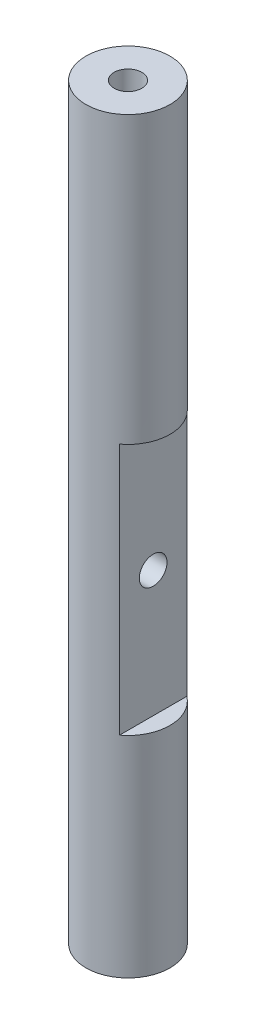
ISO-10303-21;
HEADER;
FILE_DESCRIPTION(('STEP AP214'),'2;1');
FILE_NAME('part.step','',(''),(''),'','','');
FILE_SCHEMA(('AUTOMOTIVE_DESIGN { 1 0 10303 214 1 1 1 1 }'));
ENDSEC;
DATA;
#1=APPLICATION_CONTEXT('core data for automotive mechanical design processes');
#2=APPLICATION_PROTOCOL_DEFINITION('international standard','automotive_design',2000,#1);
#3=PRODUCT_CONTEXT('',#1,'mechanical');
#4=PRODUCT('Part','Part','',(#3));
#5=PRODUCT_RELATED_PRODUCT_CATEGORY('part','',(#4));
#6=PRODUCT_DEFINITION_FORMATION('','',#4);
#7=PRODUCT_DEFINITION_CONTEXT('part definition',#1,'design');
#8=PRODUCT_DEFINITION('design','',#6,#7);
#9=PRODUCT_DEFINITION_SHAPE('','',#8);
#10=(LENGTH_UNIT() NAMED_UNIT(*) SI_UNIT(.MILLI.,.METRE.));
#11=(NAMED_UNIT(*) PLANE_ANGLE_UNIT() SI_UNIT($,.RADIAN.));
#12=(NAMED_UNIT(*) SI_UNIT($,.STERADIAN.) SOLID_ANGLE_UNIT());
#13=UNCERTAINTY_MEASURE_WITH_UNIT(LENGTH_MEASURE(1.E-05),#10,'distance_accuracy_value','');
#14=(GEOMETRIC_REPRESENTATION_CONTEXT(3) GLOBAL_UNCERTAINTY_ASSIGNED_CONTEXT((#13)) GLOBAL_UNIT_ASSIGNED_CONTEXT((#10,
#11,#12)) REPRESENTATION_CONTEXT('',''));
#15=CARTESIAN_POINT('',(0.,0.,0.));
#16=DIRECTION('',(0.,0.,1.));
#17=DIRECTION('',(1.,0.,0.));
#18=AXIS2_PLACEMENT_3D('',#15,#16,#17);
#19=CARTESIAN_POINT('',(0.,89.,0.));
#20=DIRECTION('',(0.,-1.,0.));
#21=DIRECTION('',(0.,0.,-1.));
#22=AXIS2_PLACEMENT_3D('',#19,#20,#21);
#23=CYLINDRICAL_SURFACE('',#22,5.);
#24=CARTESIAN_POINT('',(-4.7199046600541,40.,-1.65000000000001));
#25=CARTESIAN_POINT('',(-4.71990452115887,40.0899293992906,-1.65000024360505));
#26=CARTESIAN_POINT('',(-4.72250292266519,40.1798576864997,-1.64262303818655));
#27=CARTESIAN_POINT('',(-4.73256311651638,40.3570536734352,-1.61340616817483));
#28=CARTESIAN_POINT('',(-4.74002579119606,40.4443208874604,-1.59156387973589));
#29=CARTESIAN_POINT('',(-4.7588791977035,40.6135996993791,-1.53426465819809));
#30=CARTESIAN_POINT('',(-4.77026235105614,40.6956210776636,-1.49883397722407));
#31=CARTESIAN_POINT('',(-4.79566317693293,40.8525814963571,-1.41545303535854));
#32=CARTESIAN_POINT('',(-4.80968141232606,40.9275190184637,-1.36750009878644));
#33=CARTESIAN_POINT('',(-4.83937566103111,41.0710576393883,-1.25846654308763));
#34=CARTESIAN_POINT('',(-4.85509238793419,41.1393474857336,-1.19698715979909));
#35=CARTESIAN_POINT('',(-4.88606822622471,41.2648592676789,-1.06349727663171));
#36=CARTESIAN_POINT('',(-4.90132726544303,41.322079465466,-0.991485126335462));
#37=CARTESIAN_POINT('',(-4.93013890958228,41.4252335890228,-0.836704215602385));
#38=CARTESIAN_POINT('',(-4.94363804307574,41.4708423064067,-0.753707887278357));
#39=CARTESIAN_POINT('',(-4.9669298740668,41.5473287348498,-0.580699685040878));
#40=CARTESIAN_POINT('',(-4.97672354920835,41.5782103320565,-0.490689669179488));
#41=CARTESIAN_POINT('',(-4.99121262924261,41.6233130718751,-0.30947183107104));
#42=CARTESIAN_POINT('',(-4.99607073696453,41.6380672149886,-0.218409916306834));
#43=CARTESIAN_POINT('',(-5.00071837425094,41.6521899987148,-0.0349820134684143));
#44=CARTESIAN_POINT('',(-5.00050918484358,41.6515625278461,0.0573836391159467));
#45=CARTESIAN_POINT('',(-4.99515654976732,41.6352800254568,0.237027933093925));
#46=CARTESIAN_POINT('',(-4.99020313675408,41.6202037350628,0.324365615952692));
#47=CARTESIAN_POINT('',(-4.9761564157389,41.5764073968143,0.495193577669017));
#48=CARTESIAN_POINT('',(-4.96706282865063,41.5476864291757,0.578683596740289));
#49=CARTESIAN_POINT('',(-4.94551338736035,41.4770726219358,0.740723104693068));
#50=CARTESIAN_POINT('',(-4.93301533884174,41.4350133157426,0.819194207586602));
#51=CARTESIAN_POINT('',(-4.90596050876768,41.3390533249614,0.968137400016387));
#52=CARTESIAN_POINT('',(-4.8914031632388,41.2851493942767,1.03860728872219));
#53=CARTESIAN_POINT('',(-4.86097294536883,41.1641048235328,1.17299175258731));
#54=CARTESIAN_POINT('',(-4.84507036749807,41.0964676942657,1.23645304594369));
#55=CARTESIAN_POINT('',(-4.81431124792123,40.9513734103644,1.35127700383062));
#56=CARTESIAN_POINT('',(-4.79945486104331,40.8739148069589,1.40263788022031));
#57=CARTESIAN_POINT('',(-4.77230967313127,40.7099656011425,1.49241382326108));
#58=CARTESIAN_POINT('',(-4.76005891661915,40.6233656123386,1.5306415054313));
#59=CARTESIAN_POINT('',(-4.73995346804782,40.4444523928425,1.59181981773763));
#60=CARTESIAN_POINT('',(-4.73209697762932,40.3521415165417,1.61477669819905));
#61=CARTESIAN_POINT('',(-4.72207527963101,40.1688098323008,1.64384682592319));
#62=CARTESIAN_POINT('',(-4.71967327795615,40.0779131556508,1.65066145601708));
#63=CARTESIAN_POINT('',(-4.72017136658521,39.8962621521121,1.64923749492086));
#64=CARTESIAN_POINT('',(-4.72307051828919,39.8055078028708,1.64100156851917));
#65=CARTESIAN_POINT('',(-4.73360855675229,39.6298799277633,1.61033997123774));
#66=CARTESIAN_POINT('',(-4.7410857342646,39.5449112306033,1.58839792719589));
#67=CARTESIAN_POINT('',(-4.75976051805483,39.3798773929833,1.53152522846695));
#68=CARTESIAN_POINT('',(-4.77095877549978,39.2998131136739,1.49659230032422));
#69=CARTESIAN_POINT('',(-4.79624726899175,39.1440899729592,1.41348842564754));
#70=CARTESIAN_POINT('',(-4.81041691149477,39.0686468309744,1.36493806698652));
#71=CARTESIAN_POINT('',(-4.83989585604413,38.9267243962534,1.2564095799047));
#72=CARTESIAN_POINT('',(-4.85520548680907,38.8602477046731,1.19642814746824));
#73=CARTESIAN_POINT('',(-4.88610989384615,38.7349168192165,1.06339123842034));
#74=CARTESIAN_POINT('',(-4.90168425037641,38.6765677610735,0.989853763923028));
#75=CARTESIAN_POINT('',(-4.93065204495412,38.5730073584089,0.833649177353388));
#76=CARTESIAN_POINT('',(-4.94404556482348,38.5277955209476,0.750982407994641));
#77=CARTESIAN_POINT('',(-4.96707750850087,38.4522110077412,0.579295715379806));
#78=CARTESIAN_POINT('',(-4.976740841375,38.4217395412565,0.490322802958602));
#79=CARTESIAN_POINT('',(-4.99133146825929,38.3763133068078,0.308134735858253));
#80=CARTESIAN_POINT('',(-4.99626043401978,38.3613530615348,0.21492109080861));
#81=CARTESIAN_POINT('',(-5.00070328980927,38.3478591821431,0.0315225864699168));
#82=CARTESIAN_POINT('',(-5.00045646732494,38.3485996879109,-0.0586036580668516));
#83=CARTESIAN_POINT('',(-4.99516201889143,38.3647015242737,-0.237388028290519));
#84=CARTESIAN_POINT('',(-4.99011476942586,38.3800617082897,-0.326046268553985));
#85=CARTESIAN_POINT('',(-4.97587240449469,38.4244883059242,-0.498029665785508));
#86=CARTESIAN_POINT('',(-4.96674195827476,38.4533413349192,-0.581415680377138));
#87=CARTESIAN_POINT('',(-4.94527347683187,38.5237378947815,-0.742196807428904));
#88=CARTESIAN_POINT('',(-4.93293486552042,38.5652837051195,-0.819590840669547));
#89=CARTESIAN_POINT('',(-4.90576374946715,38.6616326539251,-0.969268380933019));
#90=CARTESIAN_POINT('',(-4.8908566849274,38.716864148097,-1.04126244269284));
#91=CARTESIAN_POINT('',(-4.86041514438608,38.8382836506441,-1.17519818555164));
#92=CARTESIAN_POINT('',(-4.84488047141101,38.9044751192978,-1.23713667964077));
#93=CARTESIAN_POINT('',(-4.81423121094687,39.0489558514547,-1.35160179814245));
#94=CARTESIAN_POINT('',(-4.79915525016869,39.1276102694892,-1.40367929286427));
#95=CARTESIAN_POINT('',(-4.7718636868793,39.2930216621242,-1.49383628223876));
#96=CARTESIAN_POINT('',(-4.75964726749504,39.379776312835,-1.53191977627391));
#97=CARTESIAN_POINT('',(-4.74014636717992,39.5543432724433,-1.59120734764472));
#98=CARTESIAN_POINT('',(-4.7326392026776,39.6418680419352,-1.61318355190476));
#99=CARTESIAN_POINT('',(-4.7225192193515,39.8195961712927,-1.64257737451177));
#100=CARTESIAN_POINT('',(-4.71990479936937,39.9097986450553,-1.64999975565829));
#101=CARTESIAN_POINT('',(-4.7199046600541,40.,-1.65000000000001));
#102=B_SPLINE_CURVE_WITH_KNOTS('',3,(#24,#25,#26,#27,#28,#29,#30,#31,#32,#33,#34,#35,#36,#37,
#38,#39,#40,#41,#42,#43,#44,#45,#46,#47,#48,#49,#50,#51,#52,#53,#54,#55,#56,#57,#58,#59,#60,#61,
#62,#63,#64,#65,#66,#67,#68,#69,#70,#71,#72,#73,#74,#75,#76,#77,#78,#79,#80,#81,#82,#83,#84,#85,
#86,#87,#88,#89,#90,#91,#92,#93,#94,#95,#96,#97,#98,#99,#100,#101),.UNSPECIFIED.,.T.,.F.,(4,2,2,
2,2,2,2,2,2,2,2,2,2,2,2,2,2,2,2,2,2,2,2,2,2,2,2,2,2,2,2,2,2,2,2,2,2,2,4),(0.,0.269454302916426,
0.538957495994022,0.807942623457633,1.07698527314818,1.35539043483171,1.63383926765627,
1.91939248597707,2.2048703116341,2.48059787689522,2.75625573811557,3.02131448573183,
3.28639110342469,3.55491555402298,3.82351368748603,4.10452131305697,4.38557043856028,
4.67047751353533,4.95526790443246,5.22743703243197,5.49955797597572,5.76258081799804,
6.02564971172705,6.29693565916081,6.56830013781583,6.85241935986186,7.13652791970017,
7.41870503995776,7.70078248410442,7.9698489031145,8.2388942217627,8.50382155957884,
8.76879650315111,9.04343817678379,9.31816672608177,9.60337461850671,9.88850093710109,
10.1588585876966,10.4291277478431),.UNSPECIFIED.);
#103=CARTESIAN_POINT('',(-4.7199046600541,40.,-1.65000000000001));
#104=VERTEX_POINT('',#103);
#105=EDGE_CURVE('E55',#104,#104,#102,.T.);
#106=ORIENTED_EDGE('',*,*,#105,.T.);
#107=EDGE_LOOP('',(#106));
#108=FACE_BOUND('',#107,.T.);
#109=DIRECTION('',(0.,-1.,0.));
#110=VECTOR('',#109,1.);
#111=CARTESIAN_POINT('',(3.,89.,-4.));
#112=LINE('',#111,#110);
#113=CARTESIAN_POINT('',(3.,55.,-4.));
#114=VERTEX_POINT('',#113);
#115=CARTESIAN_POINT('',(3.,25.0000000000001,-3.99999999999998));
#116=VERTEX_POINT('',#115);
#117=EDGE_CURVE('E13',#114,#116,#112,.T.);
#118=ORIENTED_EDGE('',*,*,#117,.T.);
#119=CARTESIAN_POINT('',(0.,25.,0.));
#120=DIRECTION('',(0.,-1.,0.));
#121=DIRECTION('',(0.,0.,-1.));
#122=AXIS2_PLACEMENT_3D('',#119,#120,#121);
#123=CIRCLE('',#122,5.);
#124=CARTESIAN_POINT('',(3.,25.0000000000001,3.99999999999998));
#125=VERTEX_POINT('',#124);
#126=EDGE_CURVE('E94',#116,#125,#123,.T.);
#127=ORIENTED_EDGE('',*,*,#126,.T.);
#128=DIRECTION('',(0.,-1.,0.));
#129=VECTOR('',#128,1.);
#130=CARTESIAN_POINT('',(3.,89.,4.));
#131=LINE('',#130,#129);
#132=CARTESIAN_POINT('',(3.,55.,3.99999999999998));
#133=VERTEX_POINT('',#132);
#134=EDGE_CURVE('E63',#125,#133,#131,.F.);
#135=ORIENTED_EDGE('',*,*,#134,.T.);
#136=CARTESIAN_POINT('',(0.,55.,0.));
#137=DIRECTION('',(0.,1.,0.));
#138=DIRECTION('',(0.,0.,1.));
#139=AXIS2_PLACEMENT_3D('',#136,#137,#138);
#140=CIRCLE('',#139,5.);
#141=EDGE_CURVE('E69',#133,#114,#140,.T.);
#142=ORIENTED_EDGE('',*,*,#141,.T.);
#143=EDGE_LOOP('',(#118,#127,#135,#142));
#144=FACE_BOUND('',#143,.T.);
#145=CARTESIAN_POINT('',(0.,89.,0.));
#146=DIRECTION('',(0.,1.,0.));
#147=DIRECTION('',(0.,0.,1.));
#148=AXIS2_PLACEMENT_3D('',#145,#146,#147);
#149=CIRCLE('',#148,5.);
#150=CARTESIAN_POINT('',(0.,89.,5.));
#151=VERTEX_POINT('',#150);
#152=EDGE_CURVE('E102',#151,#151,#149,.T.);
#153=ORIENTED_EDGE('',*,*,#152,.F.);
#154=EDGE_LOOP('',(#153));
#155=FACE_BOUND('',#154,.T.);
#156=CARTESIAN_POINT('',(0.,0.,0.));
#157=DIRECTION('',(0.,1.,0.));
#158=DIRECTION('',(0.,0.,1.));
#159=AXIS2_PLACEMENT_3D('',#156,#157,#158);
#160=CIRCLE('',#159,5.);
#161=CARTESIAN_POINT('',(0.,0.,5.));
#162=VERTEX_POINT('',#161);
#163=EDGE_CURVE('E105',#162,#162,#160,.T.);
#164=ORIENTED_EDGE('',*,*,#163,.T.);
#165=EDGE_LOOP('',(#164));
#166=FACE_BOUND('',#165,.T.);
#167=ADVANCED_FACE('F51',(#108,#144,#155,#166),#23,.T.);
#168=CARTESIAN_POINT('',(0.,89.,0.));
#169=DIRECTION('',(0.,1.,0.));
#170=DIRECTION('',(0.,0.,1.));
#171=AXIS2_PLACEMENT_3D('',#168,#169,#170);
#172=PLANE('',#171);
#173=CARTESIAN_POINT('',(0.,89.,0.));
#174=DIRECTION('',(0.,1.,0.));
#175=DIRECTION('',(0.,0.,1.));
#176=AXIS2_PLACEMENT_3D('',#173,#174,#175);
#177=CIRCLE('',#176,1.64999999999999);
#178=CARTESIAN_POINT('',(0.,89.,1.64999999999999));
#179=VERTEX_POINT('',#178);
#180=EDGE_CURVE('E113',#179,#179,#177,.T.);
#181=ORIENTED_EDGE('',*,*,#180,.F.);
#182=EDGE_LOOP('',(#181));
#183=FACE_BOUND('',#182,.T.);
#184=ORIENTED_EDGE('',*,*,#152,.T.);
#185=EDGE_LOOP('',(#184));
#186=FACE_BOUND('',#185,.T.);
#187=ADVANCED_FACE('F140',(#183,#186),#172,.T.);
#188=CARTESIAN_POINT('',(0.,0.,0.));
#189=DIRECTION('',(0.,1.,0.));
#190=DIRECTION('',(0.,0.,1.));
#191=AXIS2_PLACEMENT_3D('',#188,#189,#190);
#192=PLANE('',#191);
#193=CARTESIAN_POINT('',(0.,0.,0.));
#194=DIRECTION('',(0.,-1.,0.));
#195=DIRECTION('',(0.,0.,-1.));
#196=AXIS2_PLACEMENT_3D('',#193,#194,#195);
#197=CIRCLE('',#196,1.65);
#198=CARTESIAN_POINT('',(0.,0.,-1.65));
#199=VERTEX_POINT('',#198);
#200=EDGE_CURVE('E98',#199,#199,#197,.T.);
#201=ORIENTED_EDGE('',*,*,#200,.F.);
#202=EDGE_LOOP('',(#201));
#203=FACE_BOUND('',#202,.T.);
#204=ORIENTED_EDGE('',*,*,#163,.F.);
#205=EDGE_LOOP('',(#204));
#206=FACE_BOUND('',#205,.T.);
#207=ADVANCED_FACE('F144',(#203,#206),#192,.F.);
#208=CARTESIAN_POINT('',(0.,77.5,0.));
#209=DIRECTION('',(0.,1.,0.));
#210=DIRECTION('',(0.,0.,1.));
#211=AXIS2_PLACEMENT_3D('',#208,#209,#210);
#212=CONICAL_SURFACE('',#211,1.65,1.02974425867665);
#213=CARTESIAN_POINT('',(0.,76.5085799786045,0.));
#214=VERTEX_POINT('',#213);
#215=VERTEX_LOOP('',#214);
#216=FACE_BOUND('',#215,.T.);
#217=CARTESIAN_POINT('',(0.,77.5,0.));
#218=DIRECTION('',(0.,1.,0.));
#219=DIRECTION('',(0.,0.,1.));
#220=AXIS2_PLACEMENT_3D('',#217,#218,#219);
#221=CIRCLE('',#220,1.65);
#222=CARTESIAN_POINT('',(0.,77.5,1.65));
#223=VERTEX_POINT('',#222);
#224=EDGE_CURVE('E108',#223,#223,#221,.T.);
#225=ORIENTED_EDGE('',*,*,#224,.T.);
#226=EDGE_LOOP('',(#225));
#227=FACE_BOUND('',#226,.T.);
#228=ADVANCED_FACE('F150',(#216,#227),#212,.F.);
#229=CARTESIAN_POINT('',(0.,89.,0.));
#230=DIRECTION('',(0.,1.,0.));
#231=DIRECTION('',(0.,0.,1.));
#232=AXIS2_PLACEMENT_3D('',#229,#230,#231);
#233=CYLINDRICAL_SURFACE('',#232,1.64999999999999);
#234=ORIENTED_EDGE('',*,*,#224,.F.);
#235=EDGE_LOOP('',(#234));
#236=FACE_BOUND('',#235,.T.);
#237=ORIENTED_EDGE('',*,*,#180,.T.);
#238=EDGE_LOOP('',(#237));
#239=FACE_BOUND('',#238,.T.);
#240=ADVANCED_FACE('F157',(#236,#239),#233,.F.);
#241=CARTESIAN_POINT('',(0.,11.5,0.));
#242=DIRECTION('',(0.,-1.,0.));
#243=DIRECTION('',(0.,0.,-1.));
#244=AXIS2_PLACEMENT_3D('',#241,#242,#243);
#245=CONICAL_SURFACE('',#244,1.65,1.02974425867665);
#246=CARTESIAN_POINT('',(0.,12.4914200213955,0.));
#247=VERTEX_POINT('',#246);
#248=VERTEX_LOOP('',#247);
#249=FACE_BOUND('',#248,.T.);
#250=CARTESIAN_POINT('',(0.,11.5,0.));
#251=DIRECTION('',(0.,-1.,0.));
#252=DIRECTION('',(0.,0.,-1.));
#253=AXIS2_PLACEMENT_3D('',#250,#251,#252);
#254=CIRCLE('',#253,1.65);
#255=CARTESIAN_POINT('',(0.,11.5,-1.65));
#256=VERTEX_POINT('',#255);
#257=EDGE_CURVE('E116',#256,#256,#254,.T.);
#258=ORIENTED_EDGE('',*,*,#257,.T.);
#259=EDGE_LOOP('',(#258));
#260=FACE_BOUND('',#259,.T.);
#261=ADVANCED_FACE('F160',(#249,#260),#245,.F.);
#262=CARTESIAN_POINT('',(0.,0.,0.));
#263=DIRECTION('',(0.,-1.,0.));
#264=DIRECTION('',(0.,0.,-1.));
#265=AXIS2_PLACEMENT_3D('',#262,#263,#264);
#266=CYLINDRICAL_SURFACE('',#265,1.65);
#267=ORIENTED_EDGE('',*,*,#257,.F.);
#268=EDGE_LOOP('',(#267));
#269=FACE_BOUND('',#268,.T.);
#270=ORIENTED_EDGE('',*,*,#200,.T.);
#271=EDGE_LOOP('',(#270));
#272=FACE_BOUND('',#271,.T.);
#273=ADVANCED_FACE('F164',(#269,#272),#266,.F.);
#274=CARTESIAN_POINT('',(3.00000000000002,25.,13.3045452463095));
#275=DIRECTION('',(0.,-1.,0.));
#276=DIRECTION('',(0.,0.,-1.));
#277=AXIS2_PLACEMENT_3D('',#274,#275,#276);
#278=PLANE('',#277);
#279=DIRECTION('',(0.,0.,-1.));
#280=VECTOR('',#279,1.);
#281=CARTESIAN_POINT('',(3.00000000000002,25.,13.3045452463095));
#282=LINE('',#281,#280);
#283=EDGE_CURVE('E90',#125,#116,#282,.T.);
#284=ORIENTED_EDGE('',*,*,#283,.F.);
#285=ORIENTED_EDGE('',*,*,#126,.F.);
#286=EDGE_LOOP('',(#284,#285));
#287=FACE_BOUND('',#286,.T.);
#288=ADVANCED_FACE('F97',(#287),#278,.F.);
#289=CARTESIAN_POINT('',(3.,55.0000000000001,13.3045452463095));
#290=DIRECTION('',(0.,1.,0.));
#291=DIRECTION('',(0.,0.,1.));
#292=AXIS2_PLACEMENT_3D('',#289,#290,#291);
#293=PLANE('',#292);
#294=DIRECTION('',(0.,0.,1.));
#295=VECTOR('',#294,1.);
#296=CARTESIAN_POINT('',(3.,55.0000000000001,13.3045452463095));
#297=LINE('',#296,#295);
#298=EDGE_CURVE('E91',#114,#133,#297,.T.);
#299=ORIENTED_EDGE('',*,*,#298,.F.);
#300=ORIENTED_EDGE('',*,*,#141,.F.);
#301=EDGE_LOOP('',(#299,#300));
#302=FACE_BOUND('',#301,.T.);
#303=ADVANCED_FACE('F135',(#302),#293,.F.);
#304=CARTESIAN_POINT('',(3.,0.,0.));
#305=DIRECTION('',(-1.,0.,0.));
#306=DIRECTION('',(0.,0.,1.));
#307=AXIS2_PLACEMENT_3D('',#304,#305,#306);
#308=PLANE('',#307);
#309=CARTESIAN_POINT('',(3.,40.,0.));
#310=DIRECTION('',(1.,0.,0.));
#311=DIRECTION('',(0.,0.,-1.));
#312=AXIS2_PLACEMENT_3D('',#309,#310,#311);
#313=CIRCLE('',#312,1.64999999999999);
#314=CARTESIAN_POINT('',(3.,40.,-1.64999999999999));
#315=VERTEX_POINT('',#314);
#316=EDGE_CURVE('E122',#315,#315,#313,.T.);
#317=ORIENTED_EDGE('',*,*,#316,.F.);
#318=EDGE_LOOP('',(#317));
#319=FACE_BOUND('',#318,.T.);
#320=ORIENTED_EDGE('',*,*,#298,.T.);
#321=ORIENTED_EDGE('',*,*,#134,.F.);
#322=ORIENTED_EDGE('',*,*,#283,.T.);
#323=ORIENTED_EDGE('',*,*,#117,.F.);
#324=EDGE_LOOP('',(#320,#321,#322,#323));
#325=FACE_BOUND('',#324,.T.);
#326=ADVANCED_FACE('F89',(#319,#325),#308,.F.);
#327=CARTESIAN_POINT('',(3.,40.,0.));
#328=DIRECTION('',(1.,0.,0.));
#329=DIRECTION('',(0.,0.,-1.));
#330=AXIS2_PLACEMENT_3D('',#327,#328,#329);
#331=CYLINDRICAL_SURFACE('',#330,1.64999999999999);
#332=ORIENTED_EDGE('',*,*,#316,.T.);
#333=EDGE_LOOP('',(#332));
#334=FACE_BOUND('',#333,.T.);
#335=ORIENTED_EDGE('',*,*,#105,.F.);
#336=EDGE_LOOP('',(#335));
#337=FACE_BOUND('',#336,.T.);
#338=ADVANCED_FACE('F130',(#334,#337),#331,.F.);
#339=CLOSED_SHELL('',(#167,#187,#207,#228,#240,#261,#273,#288,#303,#326,#338));
#340=MANIFOLD_SOLID_BREP('B2',#339);
#341=ADVANCED_BREP_SHAPE_REPRESENTATION('',(#18,#340),#14);
#342=SHAPE_DEFINITION_REPRESENTATION(#9,#341);
ENDSEC;
END-ISO-10303-21;
